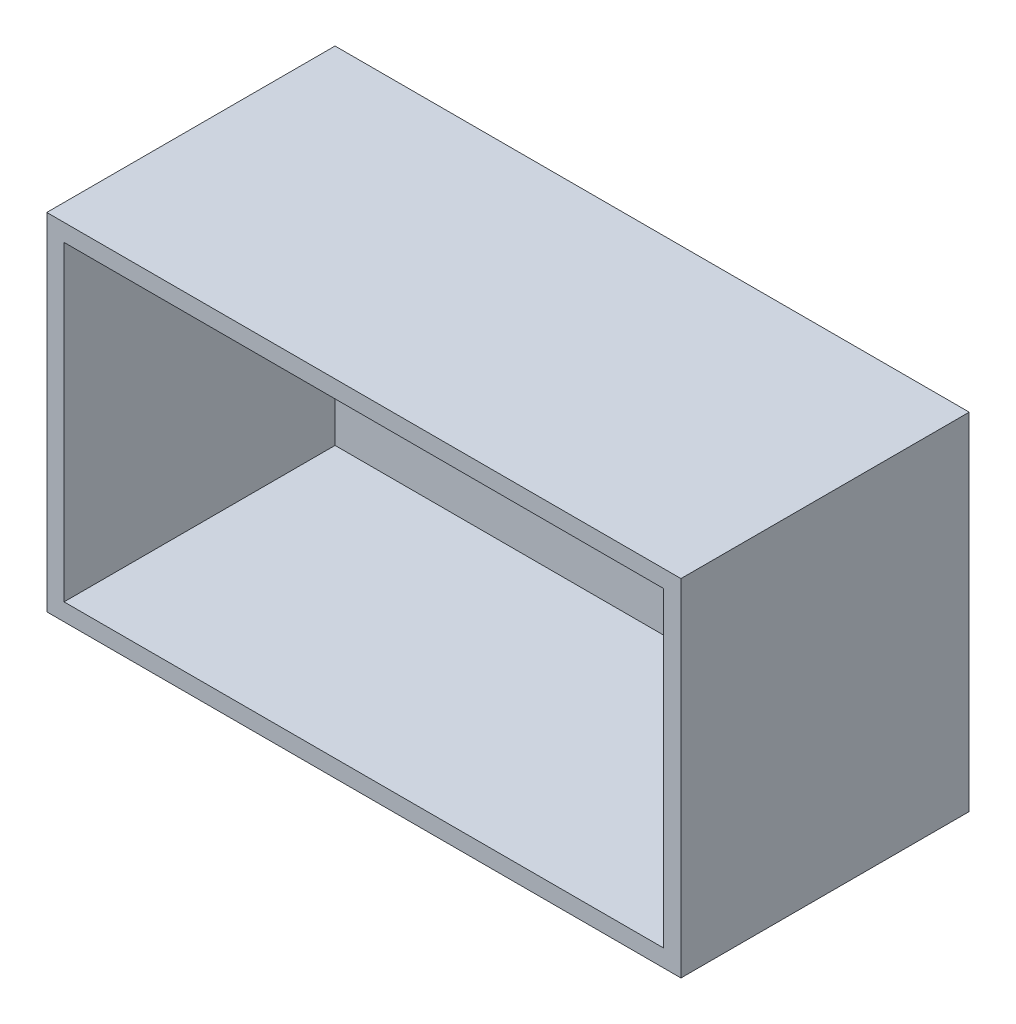
ISO-10303-21;
HEADER;
FILE_DESCRIPTION(('STEP AP214'),'2;1');
FILE_NAME('part.step','',(''),(''),'','','');
FILE_SCHEMA(('AUTOMOTIVE_DESIGN { 1 0 10303 214 1 1 1 1 }'));
ENDSEC;
DATA;
#1=APPLICATION_CONTEXT('core data for automotive mechanical design processes');
#2=APPLICATION_PROTOCOL_DEFINITION('international standard','automotive_design',2000,#1);
#3=PRODUCT_CONTEXT('',#1,'mechanical');
#4=PRODUCT('Part','Part','',(#3));
#5=PRODUCT_RELATED_PRODUCT_CATEGORY('part','',(#4));
#6=PRODUCT_DEFINITION_FORMATION('','',#4);
#7=PRODUCT_DEFINITION_CONTEXT('part definition',#1,'design');
#8=PRODUCT_DEFINITION('design','',#6,#7);
#9=PRODUCT_DEFINITION_SHAPE('','',#8);
#10=(LENGTH_UNIT() NAMED_UNIT(*) SI_UNIT(.MILLI.,.METRE.));
#11=(NAMED_UNIT(*) PLANE_ANGLE_UNIT() SI_UNIT($,.RADIAN.));
#12=(NAMED_UNIT(*) SI_UNIT($,.STERADIAN.) SOLID_ANGLE_UNIT());
#13=UNCERTAINTY_MEASURE_WITH_UNIT(LENGTH_MEASURE(1.E-05),#10,'distance_accuracy_value','');
#14=(GEOMETRIC_REPRESENTATION_CONTEXT(3) GLOBAL_UNCERTAINTY_ASSIGNED_CONTEXT((#13)) GLOBAL_UNIT_ASSIGNED_CONTEXT((#10,
#11,#12)) REPRESENTATION_CONTEXT('',''));
#15=CARTESIAN_POINT('',(0.,0.,0.));
#16=DIRECTION('',(0.,0.,1.));
#17=DIRECTION('',(1.,0.,0.));
#18=AXIS2_PLACEMENT_3D('',#15,#16,#17);
#19=CARTESIAN_POINT('',(55.,-30.,3.));
#20=DIRECTION('',(-1.,0.,0.));
#21=DIRECTION('',(0.,0.,1.));
#22=AXIS2_PLACEMENT_3D('',#19,#20,#21);
#23=PLANE('',#22);
#24=DIRECTION('',(0.,1.,0.));
#25=VECTOR('',#24,1.);
#26=CARTESIAN_POINT('',(55.,-30.,0.));
#27=LINE('',#26,#25);
#28=CARTESIAN_POINT('',(55.,-30.,0.));
#29=VERTEX_POINT('',#28);
#30=CARTESIAN_POINT('',(55.,30.,0.));
#31=VERTEX_POINT('',#30);
#32=EDGE_CURVE('E197',#29,#31,#27,.T.);
#33=ORIENTED_EDGE('',*,*,#32,.T.);
#34=DIRECTION('',(0.,0.,-1.));
#35=VECTOR('',#34,1.);
#36=CARTESIAN_POINT('',(55.,30.,3.));
#37=LINE('',#36,#35);
#38=CARTESIAN_POINT('',(55.,30.,50.));
#39=VERTEX_POINT('',#38);
#40=EDGE_CURVE('E12',#39,#31,#37,.T.);
#41=ORIENTED_EDGE('',*,*,#40,.F.);
#42=DIRECTION('',(0.,1.,0.));
#43=VECTOR('',#42,1.);
#44=CARTESIAN_POINT('',(55.,-30.,50.));
#45=LINE('',#44,#43);
#46=CARTESIAN_POINT('',(55.,-30.,50.));
#47=VERTEX_POINT('',#46);
#48=EDGE_CURVE('E148',#47,#39,#45,.T.);
#49=ORIENTED_EDGE('',*,*,#48,.F.);
#50=DIRECTION('',(0.,0.,-1.));
#51=VECTOR('',#50,1.);
#52=CARTESIAN_POINT('',(55.,-30.,3.));
#53=LINE('',#52,#51);
#54=EDGE_CURVE('E209',#47,#29,#53,.T.);
#55=ORIENTED_EDGE('',*,*,#54,.T.);
#56=EDGE_LOOP('',(#33,#41,#49,#55));
#57=FACE_BOUND('',#56,.T.);
#58=ADVANCED_FACE('F63',(#57),#23,.F.);
#59=CARTESIAN_POINT('',(-55.,30.,3.));
#60=DIRECTION('',(0.,-1.,0.));
#61=DIRECTION('',(0.,0.,-1.));
#62=AXIS2_PLACEMENT_3D('',#59,#60,#61);
#63=PLANE('',#62);
#64=DIRECTION('',(-1.,0.,0.));
#65=VECTOR('',#64,1.);
#66=CARTESIAN_POINT('',(-55.,30.,0.));
#67=LINE('',#66,#65);
#68=CARTESIAN_POINT('',(-55.,30.,0.));
#69=VERTEX_POINT('',#68);
#70=EDGE_CURVE('E201',#31,#69,#67,.T.);
#71=ORIENTED_EDGE('',*,*,#70,.T.);
#72=DIRECTION('',(0.,0.,-1.));
#73=VECTOR('',#72,1.);
#74=CARTESIAN_POINT('',(-55.,30.,3.));
#75=LINE('',#74,#73);
#76=CARTESIAN_POINT('',(-55.,30.,50.));
#77=VERTEX_POINT('',#76);
#78=EDGE_CURVE('E71',#77,#69,#75,.T.);
#79=ORIENTED_EDGE('',*,*,#78,.F.);
#80=DIRECTION('',(-1.,0.,0.));
#81=VECTOR('',#80,1.);
#82=CARTESIAN_POINT('',(-55.,30.,50.));
#83=LINE('',#82,#81);
#84=EDGE_CURVE('E185',#39,#77,#83,.T.);
#85=ORIENTED_EDGE('',*,*,#84,.F.);
#86=ORIENTED_EDGE('',*,*,#40,.T.);
#87=EDGE_LOOP('',(#71,#79,#85,#86));
#88=FACE_BOUND('',#87,.T.);
#89=ADVANCED_FACE('F230',(#88),#63,.F.);
#90=CARTESIAN_POINT('',(-55.,-30.,3.));
#91=DIRECTION('',(1.,0.,0.));
#92=DIRECTION('',(0.,0.,-1.));
#93=AXIS2_PLACEMENT_3D('',#90,#91,#92);
#94=PLANE('',#93);
#95=DIRECTION('',(0.,-1.,0.));
#96=VECTOR('',#95,1.);
#97=CARTESIAN_POINT('',(-55.,-30.,0.));
#98=LINE('',#97,#96);
#99=CARTESIAN_POINT('',(-55.,-30.,0.));
#100=VERTEX_POINT('',#99);
#101=EDGE_CURVE('E204',#69,#100,#98,.T.);
#102=ORIENTED_EDGE('',*,*,#101,.T.);
#103=DIRECTION('',(0.,0.,-1.));
#104=VECTOR('',#103,1.);
#105=CARTESIAN_POINT('',(-55.,-30.,3.));
#106=LINE('',#105,#104);
#107=CARTESIAN_POINT('',(-55.,-30.,50.));
#108=VERTEX_POINT('',#107);
#109=EDGE_CURVE('E212',#108,#100,#106,.T.);
#110=ORIENTED_EDGE('',*,*,#109,.F.);
#111=DIRECTION('',(0.,-1.,0.));
#112=VECTOR('',#111,1.);
#113=CARTESIAN_POINT('',(-55.,-30.,50.));
#114=LINE('',#113,#112);
#115=EDGE_CURVE('E189',#77,#108,#114,.T.);
#116=ORIENTED_EDGE('',*,*,#115,.F.);
#117=ORIENTED_EDGE('',*,*,#78,.T.);
#118=EDGE_LOOP('',(#102,#110,#116,#117));
#119=FACE_BOUND('',#118,.T.);
#120=ADVANCED_FACE('F219',(#119),#94,.F.);
#121=CARTESIAN_POINT('',(-55.,-30.,3.));
#122=DIRECTION('',(0.,1.,0.));
#123=DIRECTION('',(0.,0.,1.));
#124=AXIS2_PLACEMENT_3D('',#121,#122,#123);
#125=PLANE('',#124);
#126=DIRECTION('',(1.,0.,0.));
#127=VECTOR('',#126,1.);
#128=CARTESIAN_POINT('',(-55.,-30.,0.));
#129=LINE('',#128,#127);
#130=EDGE_CURVE('E86',#100,#29,#129,.T.);
#131=ORIENTED_EDGE('',*,*,#130,.T.);
#132=ORIENTED_EDGE('',*,*,#54,.F.);
#133=DIRECTION('',(1.,0.,0.));
#134=VECTOR('',#133,1.);
#135=CARTESIAN_POINT('',(-55.,-30.,50.));
#136=LINE('',#135,#134);
#137=EDGE_CURVE('E193',#108,#47,#136,.T.);
#138=ORIENTED_EDGE('',*,*,#137,.F.);
#139=ORIENTED_EDGE('',*,*,#109,.T.);
#140=EDGE_LOOP('',(#131,#132,#138,#139));
#141=FACE_BOUND('',#140,.T.);
#142=ADVANCED_FACE('F228',(#141),#125,.F.);
#143=CARTESIAN_POINT('',(0.,0.,0.));
#144=DIRECTION('',(0.,0.,-1.));
#145=DIRECTION('',(-1.,0.,0.));
#146=AXIS2_PLACEMENT_3D('',#143,#144,#145);
#147=PLANE('',#146);
#148=ORIENTED_EDGE('',*,*,#32,.F.);
#149=ORIENTED_EDGE('',*,*,#130,.F.);
#150=ORIENTED_EDGE('',*,*,#101,.F.);
#151=ORIENTED_EDGE('',*,*,#70,.F.);
#152=EDGE_LOOP('',(#148,#149,#150,#151));
#153=FACE_BOUND('',#152,.T.);
#154=ADVANCED_FACE('F224',(#153),#147,.T.);
#155=CARTESIAN_POINT('',(0.,0.,50.));
#156=DIRECTION('',(0.,0.,1.));
#157=DIRECTION('',(1.,0.,0.));
#158=AXIS2_PLACEMENT_3D('',#155,#156,#157);
#159=PLANE('',#158);
#160=ORIENTED_EDGE('',*,*,#48,.T.);
#161=ORIENTED_EDGE('',*,*,#84,.T.);
#162=ORIENTED_EDGE('',*,*,#115,.T.);
#163=ORIENTED_EDGE('',*,*,#137,.T.);
#164=EDGE_LOOP('',(#160,#161,#162,#163));
#165=FACE_BOUND('',#164,.T.);
#166=DIRECTION('',(-1.,0.,0.));
#167=VECTOR('',#166,1.);
#168=CARTESIAN_POINT('',(0.,27.,50.));
#169=LINE('',#168,#167);
#170=CARTESIAN_POINT('',(52.,27.,50.));
#171=VERTEX_POINT('',#170);
#172=CARTESIAN_POINT('',(-52.,27.,50.));
#173=VERTEX_POINT('',#172);
#174=EDGE_CURVE('E139',#171,#173,#169,.T.);
#175=ORIENTED_EDGE('',*,*,#174,.F.);
#176=DIRECTION('',(0.,1.,0.));
#177=VECTOR('',#176,1.);
#178=CARTESIAN_POINT('',(52.,0.,50.));
#179=LINE('',#178,#177);
#180=CARTESIAN_POINT('',(52.,-27.,50.));
#181=VERTEX_POINT('',#180);
#182=EDGE_CURVE('E130',#181,#171,#179,.T.);
#183=ORIENTED_EDGE('',*,*,#182,.F.);
#184=DIRECTION('',(1.,0.,0.));
#185=VECTOR('',#184,1.);
#186=CARTESIAN_POINT('',(0.,-27.,50.));
#187=LINE('',#186,#185);
#188=CARTESIAN_POINT('',(-52.,-27.,50.));
#189=VERTEX_POINT('',#188);
#190=EDGE_CURVE('E158',#189,#181,#187,.T.);
#191=ORIENTED_EDGE('',*,*,#190,.F.);
#192=DIRECTION('',(0.,-1.,0.));
#193=VECTOR('',#192,1.);
#194=CARTESIAN_POINT('',(-52.,0.,50.));
#195=LINE('',#194,#193);
#196=EDGE_CURVE('E154',#173,#189,#195,.T.);
#197=ORIENTED_EDGE('',*,*,#196,.F.);
#198=EDGE_LOOP('',(#175,#183,#191,#197));
#199=FACE_BOUND('',#198,.T.);
#200=ADVANCED_FACE('F152',(#165,#199),#159,.T.);
#201=CARTESIAN_POINT('',(52.,0.,50.));
#202=DIRECTION('',(-1.,0.,0.));
#203=DIRECTION('',(0.,0.,1.));
#204=AXIS2_PLACEMENT_3D('',#201,#202,#203);
#205=PLANE('',#204);
#206=DIRECTION('',(0.,1.,0.));
#207=VECTOR('',#206,1.);
#208=CARTESIAN_POINT('',(52.,0.,3.));
#209=LINE('',#208,#207);
#210=CARTESIAN_POINT('',(52.,-27.,3.));
#211=VERTEX_POINT('',#210);
#212=CARTESIAN_POINT('',(52.,27.,3.));
#213=VERTEX_POINT('',#212);
#214=EDGE_CURVE('E163',#211,#213,#209,.T.);
#215=ORIENTED_EDGE('',*,*,#214,.F.);
#216=DIRECTION('',(0.,0.,-1.));
#217=VECTOR('',#216,1.);
#218=CARTESIAN_POINT('',(52.,-27.,50.));
#219=LINE('',#218,#217);
#220=EDGE_CURVE('E78',#181,#211,#219,.T.);
#221=ORIENTED_EDGE('',*,*,#220,.F.);
#222=ORIENTED_EDGE('',*,*,#182,.T.);
#223=DIRECTION('',(0.,0.,-1.));
#224=VECTOR('',#223,1.);
#225=CARTESIAN_POINT('',(52.,27.,50.));
#226=LINE('',#225,#224);
#227=EDGE_CURVE('E133',#171,#213,#226,.T.);
#228=ORIENTED_EDGE('',*,*,#227,.T.);
#229=EDGE_LOOP('',(#215,#221,#222,#228));
#230=FACE_BOUND('',#229,.T.);
#231=ADVANCED_FACE('F132',(#230),#205,.T.);
#232=CARTESIAN_POINT('',(0.,27.,50.));
#233=DIRECTION('',(0.,-1.,0.));
#234=DIRECTION('',(0.,0.,-1.));
#235=AXIS2_PLACEMENT_3D('',#232,#233,#234);
#236=PLANE('',#235);
#237=DIRECTION('',(-1.,0.,0.));
#238=VECTOR('',#237,1.);
#239=CARTESIAN_POINT('',(0.,27.,3.));
#240=LINE('',#239,#238);
#241=CARTESIAN_POINT('',(-52.,27.,3.));
#242=VERTEX_POINT('',#241);
#243=EDGE_CURVE('E146',#213,#242,#240,.T.);
#244=ORIENTED_EDGE('',*,*,#243,.F.);
#245=ORIENTED_EDGE('',*,*,#227,.F.);
#246=ORIENTED_EDGE('',*,*,#174,.T.);
#247=DIRECTION('',(0.,0.,-1.));
#248=VECTOR('',#247,1.);
#249=CARTESIAN_POINT('',(-52.,27.,50.));
#250=LINE('',#249,#248);
#251=EDGE_CURVE('E149',#173,#242,#250,.T.);
#252=ORIENTED_EDGE('',*,*,#251,.T.);
#253=EDGE_LOOP('',(#244,#245,#246,#252));
#254=FACE_BOUND('',#253,.T.);
#255=ADVANCED_FACE('F143',(#254),#236,.T.);
#256=CARTESIAN_POINT('',(-52.,0.,50.));
#257=DIRECTION('',(1.,0.,0.));
#258=DIRECTION('',(0.,0.,-1.));
#259=AXIS2_PLACEMENT_3D('',#256,#257,#258);
#260=PLANE('',#259);
#261=DIRECTION('',(0.,-1.,0.));
#262=VECTOR('',#261,1.);
#263=CARTESIAN_POINT('',(-52.,0.,3.));
#264=LINE('',#263,#262);
#265=CARTESIAN_POINT('',(-52.,-27.,3.));
#266=VERTEX_POINT('',#265);
#267=EDGE_CURVE('E168',#242,#266,#264,.T.);
#268=ORIENTED_EDGE('',*,*,#267,.F.);
#269=ORIENTED_EDGE('',*,*,#251,.F.);
#270=ORIENTED_EDGE('',*,*,#196,.T.);
#271=DIRECTION('',(0.,0.,-1.));
#272=VECTOR('',#271,1.);
#273=CARTESIAN_POINT('',(-52.,-27.,50.));
#274=LINE('',#273,#272);
#275=EDGE_CURVE('E177',#189,#266,#274,.T.);
#276=ORIENTED_EDGE('',*,*,#275,.T.);
#277=EDGE_LOOP('',(#268,#269,#270,#276));
#278=FACE_BOUND('',#277,.T.);
#279=ADVANCED_FACE('F253',(#278),#260,.T.);
#280=CARTESIAN_POINT('',(0.,-27.,50.));
#281=DIRECTION('',(0.,1.,0.));
#282=DIRECTION('',(0.,0.,1.));
#283=AXIS2_PLACEMENT_3D('',#280,#281,#282);
#284=PLANE('',#283);
#285=DIRECTION('',(1.,0.,0.));
#286=VECTOR('',#285,1.);
#287=CARTESIAN_POINT('',(0.,-27.,3.));
#288=LINE('',#287,#286);
#289=EDGE_CURVE('E140',#266,#211,#288,.T.);
#290=ORIENTED_EDGE('',*,*,#289,.F.);
#291=ORIENTED_EDGE('',*,*,#275,.F.);
#292=ORIENTED_EDGE('',*,*,#190,.T.);
#293=ORIENTED_EDGE('',*,*,#220,.T.);
#294=EDGE_LOOP('',(#290,#291,#292,#293));
#295=FACE_BOUND('',#294,.T.);
#296=ADVANCED_FACE('F245',(#295),#284,.T.);
#297=CARTESIAN_POINT('',(0.,0.,3.));
#298=DIRECTION('',(0.,0.,-1.));
#299=DIRECTION('',(-1.,0.,0.));
#300=AXIS2_PLACEMENT_3D('',#297,#298,#299);
#301=PLANE('',#300);
#302=ORIENTED_EDGE('',*,*,#289,.T.);
#303=ORIENTED_EDGE('',*,*,#214,.T.);
#304=ORIENTED_EDGE('',*,*,#243,.T.);
#305=ORIENTED_EDGE('',*,*,#267,.T.);
#306=EDGE_LOOP('',(#302,#303,#304,#305));
#307=FACE_BOUND('',#306,.T.);
#308=ADVANCED_FACE('F242',(#307),#301,.F.);
#309=CLOSED_SHELL('',(#58,#89,#120,#142,#154,#200,#231,#255,#279,#296,#308));
#310=MANIFOLD_SOLID_BREP('B2',#309);
#311=ADVANCED_BREP_SHAPE_REPRESENTATION('',(#18,#310),#14);
#312=SHAPE_DEFINITION_REPRESENTATION(#9,#311);
ENDSEC;
END-ISO-10303-21;
